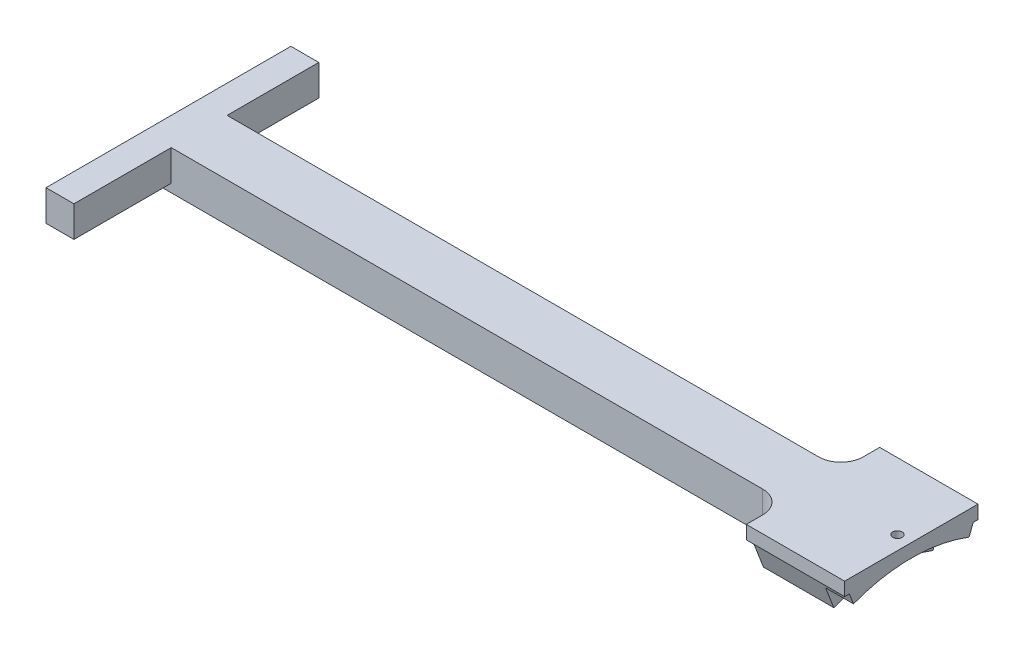
ISO-10303-21;
HEADER;
FILE_DESCRIPTION(('STEP AP214'),'2;1');
FILE_NAME('part.step','',(''),(''),'','','');
FILE_SCHEMA(('AUTOMOTIVE_DESIGN { 1 0 10303 214 1 1 1 1 }'));
ENDSEC;
DATA;
#1=APPLICATION_CONTEXT('core data for automotive mechanical design processes');
#2=APPLICATION_PROTOCOL_DEFINITION('international standard','automotive_design',2000,#1);
#3=PRODUCT_CONTEXT('',#1,'mechanical');
#4=PRODUCT('Part','Part','',(#3));
#5=PRODUCT_RELATED_PRODUCT_CATEGORY('part','',(#4));
#6=PRODUCT_DEFINITION_FORMATION('','',#4);
#7=PRODUCT_DEFINITION_CONTEXT('part definition',#1,'design');
#8=PRODUCT_DEFINITION('design','',#6,#7);
#9=PRODUCT_DEFINITION_SHAPE('','',#8);
#10=(LENGTH_UNIT() NAMED_UNIT(*) SI_UNIT(.MILLI.,.METRE.));
#11=(NAMED_UNIT(*) PLANE_ANGLE_UNIT() SI_UNIT($,.RADIAN.));
#12=(NAMED_UNIT(*) SI_UNIT($,.STERADIAN.) SOLID_ANGLE_UNIT());
#13=UNCERTAINTY_MEASURE_WITH_UNIT(LENGTH_MEASURE(1.E-05),#10,'distance_accuracy_value','');
#14=(GEOMETRIC_REPRESENTATION_CONTEXT(3) GLOBAL_UNCERTAINTY_ASSIGNED_CONTEXT((#13)) GLOBAL_UNIT_ASSIGNED_CONTEXT((#10,
#11,#12)) REPRESENTATION_CONTEXT('',''));
#15=CARTESIAN_POINT('',(0.,0.,0.));
#16=DIRECTION('',(0.,0.,1.));
#17=DIRECTION('',(1.,0.,0.));
#18=AXIS2_PLACEMENT_3D('',#15,#16,#17);
#19=CARTESIAN_POINT('',(0.,0.,0.));
#20=DIRECTION('',(-1.,0.,0.));
#21=DIRECTION('',(0.,0.,1.));
#22=AXIS2_PLACEMENT_3D('',#19,#20,#21);
#23=CYLINDRICAL_SURFACE('',#22,57.604900141811);
#24=DIRECTION('',(-1.,0.,0.));
#25=VECTOR('',#24,1.);
#26=CARTESIAN_POINT('',(0.,53.7568283113329,20.700916169433));
#27=LINE('',#26,#25);
#28=CARTESIAN_POINT('',(0.,53.7568283113329,20.700916169433));
#29=VERTEX_POINT('',#28);
#30=CARTESIAN_POINT('',(-10.,53.7568283113329,20.700916169433));
#31=VERTEX_POINT('',#30);
#32=EDGE_CURVE('E459',#29,#31,#27,.T.);
#33=ORIENTED_EDGE('',*,*,#32,.T.);
#34=CARTESIAN_POINT('',(-10.,0.,0.));
#35=DIRECTION('',(1.,0.,0.));
#36=DIRECTION('',(0.,0.,-1.));
#37=AXIS2_PLACEMENT_3D('',#34,#35,#36);
#38=CIRCLE('',#37,57.604900141811);
#39=CARTESIAN_POINT('',(-10.,53.7568283113329,-20.700916169433));
#40=VERTEX_POINT('',#39);
#41=EDGE_CURVE('E448',#40,#31,#38,.T.);
#42=ORIENTED_EDGE('',*,*,#41,.F.);
#43=DIRECTION('',(-1.,0.,0.));
#44=VECTOR('',#43,1.);
#45=CARTESIAN_POINT('',(0.,53.7568283113329,-20.700916169433));
#46=LINE('',#45,#44);
#47=CARTESIAN_POINT('',(0.,53.7568283113329,-20.700916169433));
#48=VERTEX_POINT('',#47);
#49=EDGE_CURVE('E456',#48,#40,#46,.T.);
#50=ORIENTED_EDGE('',*,*,#49,.F.);
#51=CARTESIAN_POINT('',(0.,0.,0.));
#52=DIRECTION('',(1.,0.,0.));
#53=DIRECTION('',(0.,0.,-1.));
#54=AXIS2_PLACEMENT_3D('',#51,#52,#53);
#55=CIRCLE('',#54,57.604900141811);
#56=EDGE_CURVE('E452',#48,#29,#55,.T.);
#57=ORIENTED_EDGE('',*,*,#56,.T.);
#58=EDGE_LOOP('',(#33,#42,#50,#57));
#59=FACE_BOUND('',#58,.T.);
#60=CARTESIAN_POINT('',(-4.96006567941271,57.579810006182,-1.7));
#61=CARTESIAN_POINT('',(-5.05553311554205,57.5798103447455,-1.69999577323189));
#62=CARTESIAN_POINT('',(-5.15106924539671,57.5800499843773,-1.69193121472459));
#63=CARTESIAN_POINT('',(-5.3395088598662,57.5809828822527,-1.65987285859885));
#64=CARTESIAN_POINT('',(-5.43240906053109,57.5816766824675,-1.6358600286541));
#65=CARTESIAN_POINT('',(-5.61281962816178,57.5834392398156,-1.57259068851522));
#66=CARTESIAN_POINT('',(-5.70033260567587,57.5845078136323,-1.53334162996542));
#67=CARTESIAN_POINT('',(-5.86750316137931,57.5868992769102,-1.44072464079895));
#68=CARTESIAN_POINT('',(-5.94716265179923,57.5882221042313,-1.38736015883272));
#69=CARTESIAN_POINT('',(-6.09642505390916,57.5909737092521,-1.26799916596643));
#70=CARTESIAN_POINT('',(-6.16602416577372,57.5924025266777,-1.20199790389435));
#71=CARTESIAN_POINT('',(-6.29315820063436,57.5952047122057,-1.05924511288219));
#72=CARTESIAN_POINT('',(-6.35069264341629,57.5965780780992,-0.982493156231278));
#73=CARTESIAN_POINT('',(-6.45206986502236,57.5991147395295,-0.820403861209776));
#74=CARTESIAN_POINT('',(-6.49591039898614,57.6002780006104,-0.735065118224517));
#75=CARTESIAN_POINT('',(-6.56864070161737,57.6022630169661,-0.558234726172175));
#76=CARTESIAN_POINT('',(-6.59753052925283,57.603084773588,-0.466743101374657));
#77=CARTESIAN_POINT('',(-6.63953126836139,57.6042939351153,-0.280232443757345));
#78=CARTESIAN_POINT('',(-6.65264680483554,57.6046814673325,-0.185214453290141));
#79=CARTESIAN_POINT('',(-6.66274090596121,57.6049789222708,0.00567530881562272));
#80=CARTESIAN_POINT('',(-6.65971953384531,57.6048888468633,0.101547077107178));
#81=CARTESIAN_POINT('',(-6.63762949483097,57.604241349402,0.291391609341713));
#82=CARTESIAN_POINT('',(-6.61856582303579,57.6036840728213,0.385364955072391));
#83=CARTESIAN_POINT('',(-6.5649400585497,57.6021651479062,0.568776923371601));
#84=CARTESIAN_POINT('',(-6.53037793237627,57.6012034986982,0.658215536142934));
#85=CARTESIAN_POINT('',(-6.44673062496777,57.5989839620305,0.830035251852829));
#86=CARTESIAN_POINT('',(-6.39764315468282,57.5977260278857,0.912415239781583));
#87=CARTESIAN_POINT('',(-6.28634028127957,57.5950556891172,1.06776699822224));
#88=CARTESIAN_POINT('',(-6.22412484929973,57.593643284154,1.14073874804977));
#89=CARTESIAN_POINT('',(-6.08830384527665,57.5908225432418,1.27523175232139));
#90=CARTESIAN_POINT('',(-6.01469393830778,57.5894142090501,1.3367486291584));
#91=CARTESIAN_POINT('',(-5.85818879868786,57.5867609286331,1.44655193942098));
#92=CARTESIAN_POINT('',(-5.77529356452058,57.5855159824344,1.49483837068607));
#93=CARTESIAN_POINT('',(-5.602568419556,57.5833298916476,1.57680962740958));
#94=CARTESIAN_POINT('',(-5.51273844160758,57.5823887500017,1.61049431145418));
#95=CARTESIAN_POINT('',(-5.32869488427355,57.5809165113515,1.66230306777655));
#96=CARTESIAN_POINT('',(-5.23448131646043,57.5803854132646,1.68042718113116));
#97=CARTESIAN_POINT('',(-5.04438305725526,57.5797933412208,1.70059494617237));
#98=CARTESIAN_POINT('',(-4.94849900975065,57.5797321899721,1.70264466207484));
#99=CARTESIAN_POINT('',(-4.757748160823,57.580086444186,1.69062125058452));
#100=CARTESIAN_POINT('',(-4.66288135826088,57.5805018491147,1.67654814124742));
#101=CARTESIAN_POINT('',(-4.4768748573569,57.5817622253542,1.63268358773899));
#102=CARTESIAN_POINT('',(-4.38573450867709,57.5826071213618,1.60289489896386));
#103=CARTESIAN_POINT('',(-4.20974810723365,57.584631170159,1.5284475779771));
#104=CARTESIAN_POINT('',(-4.1249020666998,57.5858103235982,1.4837889168742));
#105=CARTESIAN_POINT('',(-3.96388483020763,57.5883703937989,1.38085372447314));
#106=CARTESIAN_POINT('',(-3.88771624621608,57.5897513710265,1.32257310890925));
#107=CARTESIAN_POINT('',(-3.7462423118271,57.5925591956337,1.19405438139672));
#108=CARTESIAN_POINT('',(-3.68093698840395,57.5939860431272,1.12381623975752));
#109=CARTESIAN_POINT('',(-3.56302313170761,57.5967252746004,0.973350301535911));
#110=CARTESIAN_POINT('',(-3.51041850936349,57.5980376232433,0.893119439392559));
#111=CARTESIAN_POINT('',(-3.4194260583521,57.6003994168846,0.724961184962815));
#112=CARTESIAN_POINT('',(-3.38103819820837,57.6014488624652,0.63703380971734));
#113=CARTESIAN_POINT('',(-3.31957581752706,57.603166380661,0.455993215474249));
#114=CARTESIAN_POINT('',(-3.29649876232647,57.6038345163985,0.362880857604553));
#115=CARTESIAN_POINT('',(-3.26630475044599,57.6047143489454,0.174101203657788));
#116=CARTESIAN_POINT('',(-3.25918778117303,57.604926046115,0.0784339095967123));
#117=CARTESIAN_POINT('',(-3.26111626161472,57.6048691414938,-0.112700838653114));
#118=CARTESIAN_POINT('',(-3.27015554777957,57.6046007228654,-0.208168355146331));
#119=CARTESIAN_POINT('',(-3.30412727447791,57.6036141917931,-0.396230164330897));
#120=CARTESIAN_POINT('',(-3.32905974649077,57.6028960784586,-0.488824451330907));
#121=CARTESIAN_POINT('',(-3.39410927819022,57.6010910468065,-0.668513802623803));
#122=CARTESIAN_POINT('',(-3.43422659296129,57.6000041222934,-0.755608774507073));
#123=CARTESIAN_POINT('',(-3.52850483818178,57.5975839415571,-0.921825476891356));
#124=CARTESIAN_POINT('',(-3.58266525934117,57.5962506942676,-1.00094749639654));
#125=CARTESIAN_POINT('',(-3.70351019870148,57.5934875860355,-1.14900048290087));
#126=CARTESIAN_POINT('',(-3.77019815614383,57.5920576986309,-1.21792864202357));
#127=CARTESIAN_POINT('',(-3.91421884572388,57.5892624018306,-1.34362973402797));
#128=CARTESIAN_POINT('',(-3.99155420991675,57.5878970084904,-1.40039965247869));
#129=CARTESIAN_POINT('',(-4.15470417374536,57.5853842104057,-1.50018213002876));
#130=CARTESIAN_POINT('',(-4.24052419278354,57.5842369463722,-1.54318582094825));
#131=CARTESIAN_POINT('',(-4.41810314250526,57.5822923657631,-1.61412436895367));
#132=CARTESIAN_POINT('',(-4.5098548427762,57.5814946320248,-1.64207719833863));
#133=CARTESIAN_POINT('',(-4.66183285275432,57.5805523472232,-1.67471142967309));
#134=CARTESIAN_POINT('',(-4.72107266845227,57.5802751784265,-1.68418271418848));
#135=CARTESIAN_POINT('',(-4.84022119081465,57.5799039016546,-1.69682832526564));
#136=CARTESIAN_POINT('',(-4.90012989728828,57.5798097936272,-1.70000265362371));
#137=CARTESIAN_POINT('',(-4.96006567941271,57.579810006182,-1.7));
#138=B_SPLINE_CURVE_WITH_KNOTS('',3,(#60,#61,#62,#63,#64,#65,#66,#67,#68,#69,#70,#71,#72,#73,
#74,#75,#76,#77,#78,#79,#80,#81,#82,#83,#84,#85,#86,#87,#88,#89,#90,#91,#92,#93,#94,#95,#96,#97,
#98,#99,#100,#101,#102,#103,#104,#105,#106,#107,#108,#109,#110,#111,#112,#113,#114,#115,#116,
#117,#118,#119,#120,#121,#122,#123,#124,#125,#126,#127,#128,#129,#130,#131,#132,#133,#134,#135,
#136,#137),.UNSPECIFIED.,.T.,.F.,(4,2,2,2,2,2,2,2,2,2,2,2,2,2,2,2,2,2,2,2,2,2,2,2,2,2,2,2,2,2,2,
2,2,2,2,2,2,2,4),(0.,0.286183535152402,0.572709210761384,0.859094930283015,1.14541074517478,
1.4318344211299,1.71826949554128,2.00475150101521,2.29123237654938,2.57762923578185,
2.86402497276703,3.15033156747175,3.43663878070979,3.72299113717,4.00934412317635,
4.29580631856805,4.58226856073745,4.8687335771511,5.1551978373515,5.44155402104556,
5.72790988405443,6.01421555726476,6.3005217867495,6.58691396969858,6.87330686377024,
7.15978783469895,7.44626817134371,7.73270107008961,8.01913374282989,8.30545716592108,
8.5917811561303,8.87810995640262,9.16442837407108,9.45082551121538,9.73729357371293,
10.023945808793,10.3102549877833,10.489925036535,10.6695950340329),.UNSPECIFIED.);
#139=CARTESIAN_POINT('',(-4.96006567941271,57.579810006182,-1.7));
#140=VERTEX_POINT('',#139);
#141=EDGE_CURVE('E324',#140,#140,#138,.T.);
#142=ORIENTED_EDGE('',*,*,#141,.T.);
#143=EDGE_LOOP('',(#142));
#144=FACE_BOUND('',#143,.T.);
#145=ADVANCED_FACE('F41',(#59,#144),#23,.F.);
#146=CARTESIAN_POINT('',(-10.,0.,0.));
#147=DIRECTION('',(-1.,0.,0.));
#148=DIRECTION('',(0.,0.,1.));
#149=AXIS2_PLACEMENT_3D('',#146,#147,#148);
#150=PLANE('',#149);
#151=DIRECTION('',(0.,0.93319888028614,-0.359360334250589));
#152=VECTOR('',#151,1.);
#153=CARTESIAN_POINT('',(-10.,46.1045974929866,-17.7541614285782));
#154=LINE('',#153,#152);
#155=CARTESIAN_POINT('',(-10.,46.1045974929866,-17.7541614285782));
#156=VERTEX_POINT('',#155);
#157=EDGE_CURVE('E462',#156,#40,#154,.T.);
#158=ORIENTED_EDGE('',*,*,#157,.T.);
#159=ORIENTED_EDGE('',*,*,#41,.T.);
#160=DIRECTION('',(0.,-0.93319888028614,-0.359360334250589));
#161=VECTOR('',#160,1.);
#162=CARTESIAN_POINT('',(-10.,58.2361829367064,22.4258457738358));
#163=LINE('',#162,#161);
#164=CARTESIAN_POINT('',(-10.,46.1045974929866,17.7541614285782));
#165=VERTEX_POINT('',#164);
#166=EDGE_CURVE('E373',#31,#165,#163,.T.);
#167=ORIENTED_EDGE('',*,*,#166,.T.);
#168=CARTESIAN_POINT('',(-10.,0.,0.));
#169=DIRECTION('',(-1.,0.,0.));
#170=DIRECTION('',(0.,0.,1.));
#171=AXIS2_PLACEMENT_3D('',#168,#169,#170);
#172=CIRCLE('',#171,49.404900141811);
#173=EDGE_CURVE('E371',#165,#156,#172,.T.);
#174=ORIENTED_EDGE('',*,*,#173,.T.);
#175=EDGE_LOOP('',(#158,#159,#167,#174));
#176=FACE_BOUND('',#175,.T.);
#177=ADVANCED_FACE('F341',(#176),#150,.F.);
#178=CARTESIAN_POINT('',(-20.,46.1045974929866,-17.7541614285782));
#179=DIRECTION('',(0.,-0.359360334250589,-0.93319888028614));
#180=DIRECTION('',(0.,0.93319888028614,-0.359360334250589));
#181=AXIS2_PLACEMENT_3D('',#178,#179,#180);
#182=PLANE('',#181);
#183=DIRECTION('',(0.,-0.93319888028614,0.359360334250589));
#184=VECTOR('',#183,1.);
#185=CARTESIAN_POINT('',(-35.208375229169,46.1045974929866,-17.7541614285782));
#186=LINE('',#185,#184);
#187=CARTESIAN_POINT('',(-35.208375229169,57.604900141811,-22.1827486152637));
#188=VERTEX_POINT('',#187);
#189=CARTESIAN_POINT('',(-35.208375229169,46.7429992800409,-18.));
#190=VERTEX_POINT('',#189);
#191=EDGE_CURVE('E272',#188,#190,#186,.T.);
#192=ORIENTED_EDGE('',*,*,#191,.F.);
#193=DIRECTION('',(-1.,0.,0.));
#194=VECTOR('',#193,1.);
#195=CARTESIAN_POINT('',(-20.,57.604900141811,-22.1827486152637));
#196=LINE('',#195,#194);
#197=CARTESIAN_POINT('',(0.,57.604900141811,-22.1827486152637));
#198=VERTEX_POINT('',#197);
#199=EDGE_CURVE('E444',#198,#188,#196,.T.);
#200=ORIENTED_EDGE('',*,*,#199,.F.);
#201=DIRECTION('',(0.,-0.93319888028614,0.359360334250589));
#202=VECTOR('',#201,1.);
#203=CARTESIAN_POINT('',(0.,58.2361829367064,-22.4258457738358));
#204=LINE('',#203,#202);
#205=EDGE_CURVE('E454',#198,#48,#204,.T.);
#206=ORIENTED_EDGE('',*,*,#205,.T.);
#207=ORIENTED_EDGE('',*,*,#49,.T.);
#208=ORIENTED_EDGE('',*,*,#157,.F.);
#209=DIRECTION('',(1.,0.,0.));
#210=VECTOR('',#209,1.);
#211=CARTESIAN_POINT('',(-20.,46.1045974929866,-17.7541614285782));
#212=LINE('',#211,#210);
#213=CARTESIAN_POINT('',(-35.2121534090341,46.1045974929866,-17.7541614285782));
#214=VERTEX_POINT('',#213);
#215=EDGE_CURVE('E372',#214,#156,#212,.T.);
#216=ORIENTED_EDGE('',*,*,#215,.F.);
#217=CARTESIAN_POINT('',(-43.208375229169,46.7429992800409,-18.));
#218=DIRECTION('',(0.,-0.359360334250589,-0.93319888028614));
#219=DIRECTION('',(0.,0.93319888028614,-0.359360334250589));
#220=AXIS2_PLACEMENT_3D('',#217,#218,#219);
#221=ELLIPSE('',#220,22.2617780470491,8.);
#222=EDGE_CURVE('E392',#190,#214,#221,.T.);
#223=ORIENTED_EDGE('',*,*,#222,.F.);
#224=EDGE_LOOP('',(#192,#200,#206,#207,#208,#216,#223));
#225=FACE_BOUND('',#224,.T.);
#226=ADVANCED_FACE('F43',(#225),#182,.T.);
#227=CARTESIAN_POINT('',(-20.,0.,0.));
#228=DIRECTION('',(1.,0.,0.));
#229=DIRECTION('',(0.,0.,-1.));
#230=AXIS2_PLACEMENT_3D('',#227,#228,#229);
#231=CYLINDRICAL_SURFACE('',#230,49.404900141811);
#232=CARTESIAN_POINT('',(-35.2121534090341,46.1045974929866,-17.7541614285782));
#233=CARTESIAN_POINT('',(-35.2190456400472,46.1911944321842,-17.5293301644999));
#234=CARTESIAN_POINT('',(-35.2354820685898,46.2760274826877,-17.30408348048));
#235=CARTESIAN_POINT('',(-35.2876088433585,46.4417276400094,-16.8542905564883));
#236=CARTESIAN_POINT('',(-35.3233047292953,46.5225935984452,-16.6297445367524));
#237=CARTESIAN_POINT('',(-35.4141820266964,46.6799920414862,-16.1826717505035));
#238=CARTESIAN_POINT('',(-35.4693933385869,46.7565176661113,-15.9601486230085));
#239=CARTESIAN_POINT('',(-35.5992668937207,46.9047128997615,-15.5192179681985));
#240=CARTESIAN_POINT('',(-35.6739271086205,46.9763830141906,-15.3008100142541));
#241=CARTESIAN_POINT('',(-35.8427147092334,47.1147253445218,-14.8693732838319));
#242=CARTESIAN_POINT('',(-35.9368865031196,47.1813856781457,-14.6563580443991));
#243=CARTESIAN_POINT('',(-36.1442113324693,47.3092926897584,-14.2380762581859));
#244=CARTESIAN_POINT('',(-36.2573639658246,47.370539482391,-14.0328095473662));
#245=CARTESIAN_POINT('',(-36.5019331608854,47.4874079663005,-13.6320858607202));
#246=CARTESIAN_POINT('',(-36.6333301393194,47.5430355799852,-13.4366186683962));
#247=CARTESIAN_POINT('',(-36.9136743968671,47.6486668645516,-13.0570865802308));
#248=CARTESIAN_POINT('',(-37.0626207302576,47.698670838204,-12.8730210707751));
#249=CARTESIAN_POINT('',(-37.3699370171658,47.7909244006141,-12.5260714473044));
#250=CARTESIAN_POINT('',(-37.5275766055438,47.8334223435837,-12.3626059647592));
#251=CARTESIAN_POINT('',(-37.8568728529767,47.9133518690152,-12.0491096648173));
#252=CARTESIAN_POINT('',(-38.0285289877922,47.9507836408201,-11.8990783454028));
#253=CARTESIAN_POINT('',(-38.3847194245594,48.0206936825643,-11.6137303440724));
#254=CARTESIAN_POINT('',(-38.5692586954314,48.0531700256785,-11.4784193917335));
#255=CARTESIAN_POINT('',(-38.9498006651667,48.113279833495,-11.2237953366706));
#256=CARTESIAN_POINT('',(-39.1458029052671,48.140913491831,-11.1044815943457));
#257=CARTESIAN_POINT('',(-39.5412809628533,48.1906645233408,-10.8865102509489));
#258=CARTESIAN_POINT('',(-39.7404382676964,48.2129316645917,-10.7873084712016));
#259=CARTESIAN_POINT('',(-40.1466810520978,48.2532043844545,-10.6057097325914));
#260=CARTESIAN_POINT('',(-40.3537662197249,48.2712101305362,-10.5233121133546));
#261=CARTESIAN_POINT('',(-40.7741828467399,48.3030739604964,-10.3760726713079));
#262=CARTESIAN_POINT('',(-40.9875084354252,48.3169358132112,-10.3112149013039));
#263=CARTESIAN_POINT('',(-41.4189625311927,48.3406392464427,-10.1995095056361));
#264=CARTESIAN_POINT('',(-41.6370893339313,48.3504822300807,-10.1526555945621));
#265=CARTESIAN_POINT('',(-42.0800429724229,48.3663639214164,-10.0767365314598));
#266=CARTESIAN_POINT('',(-42.3049212535819,48.372341288752,-10.0479584054324));
#267=CARTESIAN_POINT('',(-42.7559925470466,48.3802882078068,-10.0095917616904));
#268=CARTESIAN_POINT('',(-42.9821826697855,48.3822645644061,-9.99997066234993));
#269=CARTESIAN_POINT('',(-43.208375229169,48.382271112695,-10.));
#270=B_SPLINE_CURVE_WITH_KNOTS('',3,(#232,#233,#234,#235,#236,#237,#238,#239,#240,#241,#242,
#243,#244,#245,#246,#247,#248,#249,#250,#251,#252,#253,#254,#255,#256,#257,#258,#259,#260,#261,
#262,#263,#264,#265,#266,#267,#268,#269),.UNSPECIFIED.,.F.,.F.,(4,2,2,2,2,2,2,2,2,2,2,2,2,2,2,2,
2,2,4),(0.,0.722937252157156,1.44608255794019,2.17034066301235,2.89452326478255,
3.62037257081997,4.34620650171495,5.07126726856687,5.79628898022691,6.48853609340927,
7.18075732737443,7.87324703635439,8.5657090499344,9.2357261586599,9.90571693181597,
10.5750964870222,11.2442421392624,11.923761064797,12.6021232968892),.UNSPECIFIED.);
#271=CARTESIAN_POINT('',(-43.208375229169,48.382271112695,-10.));
#272=VERTEX_POINT('',#271);
#273=EDGE_CURVE('E287',#214,#272,#270,.T.);
#274=ORIENTED_EDGE('',*,*,#273,.F.);
#275=ORIENTED_EDGE('',*,*,#215,.T.);
#276=ORIENTED_EDGE('',*,*,#173,.F.);
#277=DIRECTION('',(1.,0.,0.));
#278=VECTOR('',#277,1.);
#279=CARTESIAN_POINT('',(-20.,46.1045974929866,17.7541614285782));
#280=LINE('',#279,#278);
#281=CARTESIAN_POINT('',(-35.2121534090341,46.1045974929866,17.7541614285782));
#282=VERTEX_POINT('',#281);
#283=EDGE_CURVE('E362',#282,#165,#280,.T.);
#284=ORIENTED_EDGE('',*,*,#283,.F.);
#285=CARTESIAN_POINT('',(-43.208375229169,48.382271112695,10.));
#286=CARTESIAN_POINT('',(-42.9876157917755,48.3822651312004,9.99997369045891));
#287=CARTESIAN_POINT('',(-42.7668601306146,48.3803823271087,10.0091366459315));
#288=CARTESIAN_POINT('',(-42.3269361234929,48.3728197830737,10.0456511514377));
#289=CARTESIAN_POINT('',(-42.1077676854507,48.3671402652063,10.073001637653));
#290=CARTESIAN_POINT('',(-41.6727898425288,48.351948631148,10.145664869188));
#291=CARTESIAN_POINT('',(-41.456977290448,48.3424403628922,10.190959579634));
#292=CARTESIAN_POINT('',(-41.0300222124321,48.3195092998038,10.2991385048713));
#293=CARTESIAN_POINT('',(-40.8188796350111,48.3060865481511,10.3620225256382));
#294=CARTESIAN_POINT('',(-40.4026684182386,48.2752157478746,10.50490534803));
#295=CARTESIAN_POINT('',(-40.1976024272773,48.2577659724228,10.5849114907194));
#296=CARTESIAN_POINT('',(-39.7950791747945,48.2187219087164,10.7613743272055));
#297=CARTESIAN_POINT('',(-39.597622102689,48.1971275173659,10.8578314302076));
#298=CARTESIAN_POINT('',(-39.2117306397402,48.1496683857839,11.0663915044507));
#299=CARTESIAN_POINT('',(-39.0232948163269,48.1238043264946,11.1784919803887));
#300=CARTESIAN_POINT('',(-38.6567073172833,48.0676755926395,11.4174329411001));
#301=CARTESIAN_POINT('',(-38.4785556151094,48.0374109294325,11.5442733878265));
#302=CARTESIAN_POINT('',(-38.1331341734737,47.9722527293363,11.8121200922005));
#303=CARTESIAN_POINT('',(-37.9659042583214,47.9373435242854,11.9531738888945));
#304=CARTESIAN_POINT('',(-37.6440954861538,47.8628839884054,12.2479219667165));
#305=CARTESIAN_POINT('',(-37.4895168202497,47.823333587488,12.4016164387255));
#306=CARTESIAN_POINT('',(-37.1939686346,47.7395297204901,12.7204015628274));
#307=CARTESIAN_POINT('',(-37.0529999915985,47.6952759518086,12.8854929479247));
#308=CARTESIAN_POINT('',(-36.7855090406763,47.602050800681,13.2257334866792));
#309=CARTESIAN_POINT('',(-36.6589867282485,47.5530794197068,13.4008826371983));
#310=CARTESIAN_POINT('',(-36.4190389028664,47.4495764398284,13.7629171979025));
#311=CARTESIAN_POINT('',(-36.3058729596426,47.3949643895656,13.9499516256568));
#312=CARTESIAN_POINT('',(-36.0957345147822,47.2809845790062,14.3315143722811));
#313=CARTESIAN_POINT('',(-35.99876246375,47.2216166864436,14.5260428994935));
#314=CARTESIAN_POINT('',(-35.8213900831763,47.0982628747334,14.9211462982422));
#315=CARTESIAN_POINT('',(-35.7409927153576,47.0342761329988,15.1217222430618));
#316=CARTESIAN_POINT('',(-35.5970482918395,46.9019338064516,15.5273412708856));
#317=CARTESIAN_POINT('',(-35.5334984316569,46.8335789511214,15.732383604245));
#318=CARTESIAN_POINT('',(-35.398675860486,46.6612016025657,16.2381028994277));
#319=CARTESIAN_POINT('',(-35.3366586608924,46.5548986665089,16.5405417455487));
#320=CARTESIAN_POINT('',(-35.2702175398521,46.3899246851386,16.995444091756));
#321=CARTESIAN_POINT('',(-35.2525056012164,46.3340700821703,17.1471383077849));
#322=CARTESIAN_POINT('',(-35.2258065348808,46.2206128688346,17.4506549156091));
#323=CARTESIAN_POINT('',(-35.2168200578681,46.1630101284328,17.6024773161186));
#324=CARTESIAN_POINT('',(-35.2121534090341,46.1045974929866,17.7541614285782));
#325=B_SPLINE_CURVE_WITH_KNOTS('',3,(#285,#286,#287,#288,#289,#290,#291,#292,#293,#294,#295,
#296,#297,#298,#299,#300,#301,#302,#303,#304,#305,#306,#307,#308,#309,#310,#311,#312,#313,#314,
#315,#316,#317,#318,#319,#320,#321,#322,#323,#324),.UNSPECIFIED.,.F.,.F.,(4,2,2,2,2,2,2,2,2,2,2,
2,2,2,2,2,2,2,2,4),(0.,0.662074823892631,1.32411092535104,1.98548332747296,2.64684843440646,
3.30849766999941,3.97016336602236,4.6317236389337,5.29328220425891,5.95713194409502,
6.62099171026819,7.28489421312831,7.94879650885035,8.62399884772452,9.29921997136657,
9.97456164559255,10.649790829863,11.6269821067215,12.1146357986835,12.6023258538401),.UNSPECIFIED.);
#326=CARTESIAN_POINT('',(-43.208375229169,48.382271112695,10.));
#327=VERTEX_POINT('',#326);
#328=EDGE_CURVE('E280',#327,#282,#325,.T.);
#329=ORIENTED_EDGE('',*,*,#328,.F.);
#330=DIRECTION('',(1.,0.,0.));
#331=VECTOR('',#330,1.);
#332=CARTESIAN_POINT('',(-20.,48.382271112695,10.));
#333=LINE('',#332,#331);
#334=CARTESIAN_POINT('',(-265.,48.382271112695,9.99999999999997));
#335=VERTEX_POINT('',#334);
#336=EDGE_CURVE('E251',#335,#327,#333,.T.);
#337=ORIENTED_EDGE('',*,*,#336,.F.);
#338=CARTESIAN_POINT('',(-265.,0.,0.));
#339=DIRECTION('',(1.,0.,0.));
#340=DIRECTION('',(0.,0.,1.));
#341=AXIS2_PLACEMENT_3D('',#338,#339,#340);
#342=CIRCLE('',#341,49.404900141811);
#343=CARTESIAN_POINT('',(-265.,48.382271112695,-9.99999999999997));
#344=VERTEX_POINT('',#343);
#345=EDGE_CURVE('E391',#344,#335,#342,.T.);
#346=ORIENTED_EDGE('',*,*,#345,.F.);
#347=DIRECTION('',(1.,0.,0.));
#348=VECTOR('',#347,1.);
#349=CARTESIAN_POINT('',(-20.,48.382271112695,-10.));
#350=LINE('',#349,#348);
#351=EDGE_CURVE('E268',#272,#344,#350,.F.);
#352=ORIENTED_EDGE('',*,*,#351,.F.);
#353=EDGE_LOOP('',(#274,#275,#276,#284,#329,#337,#346,#352));
#354=FACE_BOUND('',#353,.T.);
#355=ADVANCED_FACE('F294',(#354),#231,.F.);
#356=CARTESIAN_POINT('',(-20.,58.2361829367064,22.4258457738358));
#357=DIRECTION('',(0.,-0.359360334250589,0.93319888028614));
#358=DIRECTION('',(0.,-0.93319888028614,-0.359360334250589));
#359=AXIS2_PLACEMENT_3D('',#356,#357,#358);
#360=PLANE('',#359);
#361=CARTESIAN_POINT('',(-43.208375229169,46.7429992800409,18.));
#362=DIRECTION('',(0.,-0.359360334250589,0.93319888028614));
#363=DIRECTION('',(0.,0.93319888028614,0.359360334250589));
#364=AXIS2_PLACEMENT_3D('',#361,#362,#363);
#365=ELLIPSE('',#364,22.2617780470491,8.);
#366=CARTESIAN_POINT('',(-35.208375229169,46.7429992800409,18.));
#367=VERTEX_POINT('',#366);
#368=EDGE_CURVE('E278',#282,#367,#365,.T.);
#369=ORIENTED_EDGE('',*,*,#368,.F.);
#370=ORIENTED_EDGE('',*,*,#283,.T.);
#371=ORIENTED_EDGE('',*,*,#166,.F.);
#372=ORIENTED_EDGE('',*,*,#32,.F.);
#373=DIRECTION('',(0.,0.93319888028614,0.359360334250589));
#374=VECTOR('',#373,1.);
#375=CARTESIAN_POINT('',(0.,53.7568283113329,20.700916169433));
#376=LINE('',#375,#374);
#377=CARTESIAN_POINT('',(0.,57.604900141811,22.1827486152637));
#378=VERTEX_POINT('',#377);
#379=EDGE_CURVE('E449',#29,#378,#376,.T.);
#380=ORIENTED_EDGE('',*,*,#379,.T.);
#381=DIRECTION('',(1.,0.,0.));
#382=VECTOR('',#381,1.);
#383=CARTESIAN_POINT('',(-20.,57.604900141811,22.1827486152637));
#384=LINE('',#383,#382);
#385=CARTESIAN_POINT('',(-35.208375229169,57.604900141811,22.1827486152637));
#386=VERTEX_POINT('',#385);
#387=EDGE_CURVE('E442',#386,#378,#384,.T.);
#388=ORIENTED_EDGE('',*,*,#387,.F.);
#389=DIRECTION('',(0.,0.93319888028614,0.359360334250589));
#390=VECTOR('',#389,1.);
#391=CARTESIAN_POINT('',(-35.208375229169,58.2361829367064,22.4258457738358));
#392=LINE('',#391,#390);
#393=EDGE_CURVE('E276',#367,#386,#392,.T.);
#394=ORIENTED_EDGE('',*,*,#393,.F.);
#395=EDGE_LOOP('',(#369,#370,#371,#372,#380,#388,#394));
#396=FACE_BOUND('',#395,.T.);
#397=ADVANCED_FACE('F347',(#396),#360,.T.);
#398=CARTESIAN_POINT('',(0.,0.,0.));
#399=DIRECTION('',(1.,0.,0.));
#400=DIRECTION('',(0.,0.,-1.));
#401=AXIS2_PLACEMENT_3D('',#398,#399,#400);
#402=PLANE('',#401);
#403=DIRECTION('',(0.,0.,-1.));
#404=VECTOR('',#403,1.);
#405=CARTESIAN_POINT('',(0.,62.404900141811,23.8802785702158));
#406=LINE('',#405,#404);
#407=CARTESIAN_POINT('',(0.,62.404900141811,23.8802785702158));
#408=VERTEX_POINT('',#407);
#409=CARTESIAN_POINT('',(0.,62.404900141811,-23.8802785702158));
#410=VERTEX_POINT('',#409);
#411=EDGE_CURVE('E432',#408,#410,#406,.T.);
#412=ORIENTED_EDGE('',*,*,#411,.F.);
#413=DIRECTION('',(0.,1.,0.));
#414=VECTOR('',#413,1.);
#415=CARTESIAN_POINT('',(0.,57.604900141811,23.8802785702158));
#416=LINE('',#415,#414);
#417=CARTESIAN_POINT('',(0.,57.604900141811,23.8802785702158));
#418=VERTEX_POINT('',#417);
#419=EDGE_CURVE('E335',#418,#408,#416,.T.);
#420=ORIENTED_EDGE('',*,*,#419,.F.);
#421=DIRECTION('',(0.,0.,-1.));
#422=VECTOR('',#421,1.);
#423=CARTESIAN_POINT('',(0.,57.604900141811,23.8802785702158));
#424=LINE('',#423,#422);
#425=EDGE_CURVE('E445',#418,#378,#424,.T.);
#426=ORIENTED_EDGE('',*,*,#425,.T.);
#427=ORIENTED_EDGE('',*,*,#379,.F.);
#428=ORIENTED_EDGE('',*,*,#56,.F.);
#429=ORIENTED_EDGE('',*,*,#205,.F.);
#430=CARTESIAN_POINT('',(0.,57.604900141811,-23.8802785702158));
#431=VERTEX_POINT('',#430);
#432=EDGE_CURVE('E472',#198,#431,#424,.T.);
#433=ORIENTED_EDGE('',*,*,#432,.T.);
#434=DIRECTION('',(0.,-1.,0.));
#435=VECTOR('',#434,1.);
#436=CARTESIAN_POINT('',(0.,62.404900141811,-23.8802785702158));
#437=LINE('',#436,#435);
#438=EDGE_CURVE('E440',#410,#431,#437,.T.);
#439=ORIENTED_EDGE('',*,*,#438,.F.);
#440=EDGE_LOOP('',(#412,#420,#426,#427,#428,#429,#433,#439));
#441=FACE_BOUND('',#440,.T.);
#442=ADVANCED_FACE('F343',(#441),#402,.T.);
#443=CARTESIAN_POINT('',(-68.0011543440825,57.604900141811,23.8802785702158));
#444=DIRECTION('',(0.,-1.,0.));
#445=DIRECTION('',(0.,0.,-1.));
#446=AXIS2_PLACEMENT_3D('',#443,#444,#445);
#447=PLANE('',#446);
#448=DIRECTION('',(0.,0.,1.));
#449=VECTOR('',#448,1.);
#450=CARTESIAN_POINT('',(-35.2083752291691,57.604900141811,23.8802785702159));
#451=LINE('',#450,#449);
#452=CARTESIAN_POINT('',(-35.208375229169,57.604900141811,-23.8802785702158));
#453=VERTEX_POINT('',#452);
#454=EDGE_CURVE('E270',#453,#188,#451,.T.);
#455=ORIENTED_EDGE('',*,*,#454,.F.);
#456=DIRECTION('',(1.,0.,0.));
#457=VECTOR('',#456,1.);
#458=CARTESIAN_POINT('',(-68.0011543440825,57.604900141811,-23.8802785702158));
#459=LINE('',#458,#457);
#460=EDGE_CURVE('E332',#453,#431,#459,.T.);
#461=ORIENTED_EDGE('',*,*,#460,.T.);
#462=ORIENTED_EDGE('',*,*,#432,.F.);
#463=ORIENTED_EDGE('',*,*,#199,.T.);
#464=EDGE_LOOP('',(#455,#461,#462,#463));
#465=FACE_BOUND('',#464,.T.);
#466=ADVANCED_FACE('F355',(#465),#447,.T.);
#467=CARTESIAN_POINT('',(-68.0011543440825,62.404900141811,23.8802785702158));
#468=DIRECTION('',(0.,-1.,0.));
#469=DIRECTION('',(0.,0.,-1.));
#470=AXIS2_PLACEMENT_3D('',#467,#468,#469);
#471=PLANE('',#470);
#472=DIRECTION('',(0.,0.,-1.));
#473=VECTOR('',#472,1.);
#474=CARTESIAN_POINT('',(-265.,62.404900141811,23.8802785702158));
#475=LINE('',#474,#473);
#476=CARTESIAN_POINT('',(-265.,62.404900141811,44.8485469815196));
#477=VERTEX_POINT('',#476);
#478=CARTESIAN_POINT('',(-265.,62.404900141811,-42.8355056978477));
#479=VERTEX_POINT('',#478);
#480=EDGE_CURVE('E388',#477,#479,#475,.T.);
#481=ORIENTED_EDGE('',*,*,#480,.F.);
#482=DIRECTION('',(-1.,0.,0.));
#483=VECTOR('',#482,1.);
#484=CARTESIAN_POINT('',(-255.,62.404900141811,44.8485469815196));
#485=LINE('',#484,#483);
#486=CARTESIAN_POINT('',(-255.,62.404900141811,44.8485469815196));
#487=VERTEX_POINT('',#486);
#488=EDGE_CURVE('E230',#487,#477,#485,.T.);
#489=ORIENTED_EDGE('',*,*,#488,.F.);
#490=DIRECTION('',(0.,0.,-1.));
#491=VECTOR('',#490,1.);
#492=CARTESIAN_POINT('',(-255.,62.404900141811,-42.8355056978477));
#493=LINE('',#492,#491);
#494=CARTESIAN_POINT('',(-255.,62.404900141811,9.99999999999998));
#495=VERTEX_POINT('',#494);
#496=EDGE_CURVE('E200',#487,#495,#493,.T.);
#497=ORIENTED_EDGE('',*,*,#496,.T.);
#498=DIRECTION('',(-1.,0.,0.));
#499=VECTOR('',#498,1.);
#500=CARTESIAN_POINT('',(-43.208375229169,62.404900141811,10.));
#501=LINE('',#500,#499);
#502=CARTESIAN_POINT('',(-43.208375229169,62.404900141811,10.));
#503=VERTEX_POINT('',#502);
#504=EDGE_CURVE('E61',#503,#495,#501,.T.);
#505=ORIENTED_EDGE('',*,*,#504,.F.);
#506=CARTESIAN_POINT('',(-43.208375229169,62.404900141811,18.));
#507=DIRECTION('',(0.,1.,0.));
#508=DIRECTION('',(0.,0.,-1.));
#509=AXIS2_PLACEMENT_3D('',#506,#507,#508);
#510=CIRCLE('',#509,8.);
#511=CARTESIAN_POINT('',(-35.208375229169,62.404900141811,18.));
#512=VERTEX_POINT('',#511);
#513=EDGE_CURVE('E242',#512,#503,#510,.T.);
#514=ORIENTED_EDGE('',*,*,#513,.F.);
#515=DIRECTION('',(0.,0.,-1.));
#516=VECTOR('',#515,1.);
#517=CARTESIAN_POINT('',(-35.208375229169,62.404900141811,23.8802785702158));
#518=LINE('',#517,#516);
#519=CARTESIAN_POINT('',(-35.208375229169,62.404900141811,23.8802785702158));
#520=VERTEX_POINT('',#519);
#521=EDGE_CURVE('E258',#520,#512,#518,.T.);
#522=ORIENTED_EDGE('',*,*,#521,.F.);
#523=DIRECTION('',(1.,0.,0.));
#524=VECTOR('',#523,1.);
#525=CARTESIAN_POINT('',(-68.0011543440825,62.404900141811,23.8802785702158));
#526=LINE('',#525,#524);
#527=EDGE_CURVE('E426',#520,#408,#526,.T.);
#528=ORIENTED_EDGE('',*,*,#527,.T.);
#529=ORIENTED_EDGE('',*,*,#411,.T.);
#530=DIRECTION('',(1.,0.,0.));
#531=VECTOR('',#530,1.);
#532=CARTESIAN_POINT('',(-68.0011543440825,62.404900141811,-23.8802785702158));
#533=LINE('',#532,#531);
#534=CARTESIAN_POINT('',(-35.208375229169,62.404900141811,-23.8802785702158));
#535=VERTEX_POINT('',#534);
#536=EDGE_CURVE('E434',#535,#410,#533,.T.);
#537=ORIENTED_EDGE('',*,*,#536,.F.);
#538=DIRECTION('',(0.,0.,-1.));
#539=VECTOR('',#538,1.);
#540=CARTESIAN_POINT('',(-35.208375229169,62.404900141811,-23.8802785702158));
#541=LINE('',#540,#539);
#542=CARTESIAN_POINT('',(-35.208375229169,62.404900141811,-18.));
#543=VERTEX_POINT('',#542);
#544=EDGE_CURVE('E245',#543,#535,#541,.T.);
#545=ORIENTED_EDGE('',*,*,#544,.F.);
#546=CARTESIAN_POINT('',(-43.208375229169,62.404900141811,-18.));
#547=DIRECTION('',(0.,1.,0.));
#548=DIRECTION('',(0.,0.,1.));
#549=AXIS2_PLACEMENT_3D('',#546,#547,#548);
#550=CIRCLE('',#549,8.);
#551=CARTESIAN_POINT('',(-43.208375229169,62.404900141811,-10.));
#552=VERTEX_POINT('',#551);
#553=EDGE_CURVE('E241',#552,#543,#550,.T.);
#554=ORIENTED_EDGE('',*,*,#553,.F.);
#555=DIRECTION('',(1.,0.,0.));
#556=VECTOR('',#555,1.);
#557=CARTESIAN_POINT('',(-43.208375229169,62.404900141811,-10.));
#558=LINE('',#557,#556);
#559=CARTESIAN_POINT('',(-255.,62.404900141811,-9.99999999999998));
#560=VERTEX_POINT('',#559);
#561=EDGE_CURVE('E239',#560,#552,#558,.T.);
#562=ORIENTED_EDGE('',*,*,#561,.F.);
#563=CARTESIAN_POINT('',(-255.,62.404900141811,-42.8355056978477));
#564=VERTEX_POINT('',#563);
#565=EDGE_CURVE('E222',#560,#564,#493,.T.);
#566=ORIENTED_EDGE('',*,*,#565,.T.);
#567=DIRECTION('',(-1.,0.,0.));
#568=VECTOR('',#567,1.);
#569=CARTESIAN_POINT('',(-255.,62.404900141811,-42.8355056978477));
#570=LINE('',#569,#568);
#571=EDGE_CURVE('E214',#564,#479,#570,.T.);
#572=ORIENTED_EDGE('',*,*,#571,.T.);
#573=EDGE_LOOP('',(#481,#489,#497,#505,#514,#522,#528,#529,#537,#545,#554,#562,#566,#572));
#574=FACE_BOUND('',#573,.T.);
#575=CARTESIAN_POINT('',(-4.96006567941271,62.404900141811,0.));
#576=DIRECTION('',(0.,1.,0.));
#577=DIRECTION('',(0.,0.,1.));
#578=AXIS2_PLACEMENT_3D('',#575,#576,#577);
#579=CIRCLE('',#578,1.7);
#580=CARTESIAN_POINT('',(-4.96006567941271,62.404900141811,1.7));
#581=VERTEX_POINT('',#580);
#582=EDGE_CURVE('E333',#581,#581,#579,.T.);
#583=ORIENTED_EDGE('',*,*,#582,.F.);
#584=EDGE_LOOP('',(#583));
#585=FACE_BOUND('',#584,.T.);
#586=ADVANCED_FACE('F394',(#574,#585),#471,.F.);
#587=DIRECTION('',(0.,0.,1.));
#588=VECTOR('',#587,1.);
#589=CARTESIAN_POINT('',(-35.208375229169,57.604900141811,23.8802785702157));
#590=LINE('',#589,#588);
#591=CARTESIAN_POINT('',(-35.208375229169,57.604900141811,23.8802785702158));
#592=VERTEX_POINT('',#591);
#593=EDGE_CURVE('E274',#386,#592,#590,.T.);
#594=ORIENTED_EDGE('',*,*,#593,.F.);
#595=ORIENTED_EDGE('',*,*,#387,.T.);
#596=ORIENTED_EDGE('',*,*,#425,.F.);
#597=DIRECTION('',(1.,0.,0.));
#598=VECTOR('',#597,1.);
#599=CARTESIAN_POINT('',(-68.0011543440825,57.604900141811,23.8802785702158));
#600=LINE('',#599,#598);
#601=EDGE_CURVE('E435',#592,#418,#600,.T.);
#602=ORIENTED_EDGE('',*,*,#601,.F.);
#603=EDGE_LOOP('',(#594,#595,#596,#602));
#604=FACE_BOUND('',#603,.T.);
#605=ADVANCED_FACE('F408',(#604),#447,.T.);
#606=CARTESIAN_POINT('',(-68.0011543440825,57.604900141811,23.8802785702158));
#607=DIRECTION('',(0.,0.,-1.));
#608=DIRECTION('',(-1.,0.,0.));
#609=AXIS2_PLACEMENT_3D('',#606,#607,#608);
#610=PLANE('',#609);
#611=ORIENTED_EDGE('',*,*,#527,.F.);
#612=DIRECTION('',(0.,1.,0.));
#613=VECTOR('',#612,1.);
#614=CARTESIAN_POINT('',(-35.208375229169,46.1045974929866,23.8802785702158));
#615=LINE('',#614,#613);
#616=EDGE_CURVE('E259',#592,#520,#615,.T.);
#617=ORIENTED_EDGE('',*,*,#616,.F.);
#618=ORIENTED_EDGE('',*,*,#601,.T.);
#619=ORIENTED_EDGE('',*,*,#419,.T.);
#620=EDGE_LOOP('',(#611,#617,#618,#619));
#621=FACE_BOUND('',#620,.T.);
#622=ADVANCED_FACE('F413',(#621),#610,.F.);
#623=CARTESIAN_POINT('',(-68.0011543440825,62.404900141811,-23.8802785702158));
#624=DIRECTION('',(0.,0.,1.));
#625=DIRECTION('',(1.,0.,0.));
#626=AXIS2_PLACEMENT_3D('',#623,#624,#625);
#627=PLANE('',#626);
#628=ORIENTED_EDGE('',*,*,#460,.F.);
#629=DIRECTION('',(0.,1.,0.));
#630=VECTOR('',#629,1.);
#631=CARTESIAN_POINT('',(-35.208375229169,46.1045974929866,-23.8802785702158));
#632=LINE('',#631,#630);
#633=EDGE_CURVE('E248',#453,#535,#632,.T.);
#634=ORIENTED_EDGE('',*,*,#633,.T.);
#635=ORIENTED_EDGE('',*,*,#536,.T.);
#636=ORIENTED_EDGE('',*,*,#438,.T.);
#637=EDGE_LOOP('',(#628,#634,#635,#636));
#638=FACE_BOUND('',#637,.T.);
#639=ADVANCED_FACE('F320',(#638),#627,.F.);
#640=CARTESIAN_POINT('',(-4.96006567941271,62.404900141811,0.));
#641=DIRECTION('',(0.,-1.,0.));
#642=DIRECTION('',(0.,0.,-1.));
#643=AXIS2_PLACEMENT_3D('',#640,#641,#642);
#644=CYLINDRICAL_SURFACE('',#643,1.7);
#645=ORIENTED_EDGE('',*,*,#141,.F.);
#646=EDGE_LOOP('',(#645));
#647=FACE_BOUND('',#646,.T.);
#648=ORIENTED_EDGE('',*,*,#582,.T.);
#649=EDGE_LOOP('',(#648));
#650=FACE_BOUND('',#649,.T.);
#651=ADVANCED_FACE('F315',(#647,#650),#644,.F.);
#652=CARTESIAN_POINT('',(-265.,0.,0.));
#653=DIRECTION('',(-1.,0.,0.));
#654=DIRECTION('',(0.,0.,1.));
#655=AXIS2_PLACEMENT_3D('',#652,#653,#654);
#656=PLANE('',#655);
#657=DIRECTION('',(0.,-1.,0.));
#658=VECTOR('',#657,1.);
#659=CARTESIAN_POINT('',(-265.,0.,9.99999999999997));
#660=LINE('',#659,#658);
#661=CARTESIAN_POINT('',(-265.,51.3444293691663,9.99999999999997));
#662=VERTEX_POINT('',#661);
#663=EDGE_CURVE('E375',#662,#335,#660,.T.);
#664=ORIENTED_EDGE('',*,*,#663,.F.);
#665=DIRECTION('',(0.,0.,1.));
#666=VECTOR('',#665,1.);
#667=CARTESIAN_POINT('',(-265.,51.3444293691663,-42.8355056978477));
#668=LINE('',#667,#666);
#669=CARTESIAN_POINT('',(-265.,51.3444293691663,44.8485469815196));
#670=VERTEX_POINT('',#669);
#671=EDGE_CURVE('E227',#662,#670,#668,.T.);
#672=ORIENTED_EDGE('',*,*,#671,.T.);
#673=DIRECTION('',(0.,1.,0.));
#674=VECTOR('',#673,1.);
#675=CARTESIAN_POINT('',(-265.,62.404900141811,44.8485469815196));
#676=LINE('',#675,#674);
#677=EDGE_CURVE('E215',#670,#477,#676,.T.);
#678=ORIENTED_EDGE('',*,*,#677,.T.);
#679=ORIENTED_EDGE('',*,*,#480,.T.);
#680=DIRECTION('',(0.,-1.,0.));
#681=VECTOR('',#680,1.);
#682=CARTESIAN_POINT('',(-265.,62.404900141811,-42.8355056978477));
#683=LINE('',#682,#681);
#684=CARTESIAN_POINT('',(-265.,51.3444293691663,-42.8355056978477));
#685=VERTEX_POINT('',#684);
#686=EDGE_CURVE('E225',#479,#685,#683,.T.);
#687=ORIENTED_EDGE('',*,*,#686,.T.);
#688=CARTESIAN_POINT('',(-265.,51.3444293691663,-9.99999999999997));
#689=VERTEX_POINT('',#688);
#690=EDGE_CURVE('E194',#685,#689,#668,.T.);
#691=ORIENTED_EDGE('',*,*,#690,.T.);
#692=DIRECTION('',(0.,1.,0.));
#693=VECTOR('',#692,1.);
#694=CARTESIAN_POINT('',(-265.,0.,-9.99999999999997));
#695=LINE('',#694,#693);
#696=EDGE_CURVE('E381',#344,#689,#695,.T.);
#697=ORIENTED_EDGE('',*,*,#696,.F.);
#698=ORIENTED_EDGE('',*,*,#345,.T.);
#699=EDGE_LOOP('',(#664,#672,#678,#679,#687,#691,#697,#698));
#700=FACE_BOUND('',#699,.T.);
#701=ADVANCED_FACE('F303',(#700),#656,.T.);
#702=CARTESIAN_POINT('',(-43.208375229169,46.1045974929866,18.));
#703=DIRECTION('',(0.,1.,0.));
#704=DIRECTION('',(0.,0.,1.));
#705=AXIS2_PLACEMENT_3D('',#702,#703,#704);
#706=CYLINDRICAL_SURFACE('',#705,8.);
#707=ORIENTED_EDGE('',*,*,#328,.T.);
#708=ORIENTED_EDGE('',*,*,#368,.T.);
#709=DIRECTION('',(0.,1.,0.));
#710=VECTOR('',#709,1.);
#711=CARTESIAN_POINT('',(-35.208375229169,46.1045974929866,18.));
#712=LINE('',#711,#710);
#713=EDGE_CURVE('E238',#367,#512,#712,.T.);
#714=ORIENTED_EDGE('',*,*,#713,.T.);
#715=ORIENTED_EDGE('',*,*,#513,.T.);
#716=DIRECTION('',(0.,1.,0.));
#717=VECTOR('',#716,1.);
#718=CARTESIAN_POINT('',(-43.208375229169,46.1045974929866,10.));
#719=LINE('',#718,#717);
#720=EDGE_CURVE('E256',#327,#503,#719,.T.);
#721=ORIENTED_EDGE('',*,*,#720,.F.);
#722=EDGE_LOOP('',(#707,#708,#714,#715,#721));
#723=FACE_BOUND('',#722,.T.);
#724=ADVANCED_FACE('F297',(#723),#706,.F.);
#725=CARTESIAN_POINT('',(-35.208375229169,46.1045974929866,23.8802785702158));
#726=DIRECTION('',(1.,0.,0.));
#727=DIRECTION('',(0.,0.,-1.));
#728=AXIS2_PLACEMENT_3D('',#725,#726,#727);
#729=PLANE('',#728);
#730=ORIENTED_EDGE('',*,*,#393,.T.);
#731=ORIENTED_EDGE('',*,*,#593,.T.);
#732=ORIENTED_EDGE('',*,*,#616,.T.);
#733=ORIENTED_EDGE('',*,*,#521,.T.);
#734=ORIENTED_EDGE('',*,*,#713,.F.);
#735=EDGE_LOOP('',(#730,#731,#732,#733,#734));
#736=FACE_BOUND('',#735,.T.);
#737=ADVANCED_FACE('F302',(#736),#729,.F.);
#738=CARTESIAN_POINT('',(-43.208375229169,46.1045974929866,10.));
#739=DIRECTION('',(0.,0.,-1.));
#740=DIRECTION('',(-1.,0.,0.));
#741=AXIS2_PLACEMENT_3D('',#738,#739,#740);
#742=PLANE('',#741);
#743=DIRECTION('',(0.,1.,0.));
#744=VECTOR('',#743,1.);
#745=CARTESIAN_POINT('',(-255.,46.1045974929866,9.99999999999998));
#746=LINE('',#745,#744);
#747=CARTESIAN_POINT('',(-255.,51.3444293691663,9.99999999999998));
#748=VERTEX_POINT('',#747);
#749=EDGE_CURVE('E56',#748,#495,#746,.T.);
#750=ORIENTED_EDGE('',*,*,#749,.F.);
#751=DIRECTION('',(-1.,0.,0.));
#752=VECTOR('',#751,1.);
#753=CARTESIAN_POINT('',(-43.208375229169,51.3444293691663,10.));
#754=LINE('',#753,#752);
#755=EDGE_CURVE('E236',#748,#662,#754,.T.);
#756=ORIENTED_EDGE('',*,*,#755,.T.);
#757=ORIENTED_EDGE('',*,*,#663,.T.);
#758=ORIENTED_EDGE('',*,*,#336,.T.);
#759=ORIENTED_EDGE('',*,*,#720,.T.);
#760=ORIENTED_EDGE('',*,*,#504,.T.);
#761=EDGE_LOOP('',(#750,#756,#757,#758,#759,#760));
#762=FACE_BOUND('',#761,.T.);
#763=ADVANCED_FACE('F306',(#762),#742,.F.);
#764=CARTESIAN_POINT('',(-35.208375229169,46.1045974929866,-23.8802785702158));
#765=DIRECTION('',(1.,0.,0.));
#766=DIRECTION('',(0.,0.,-1.));
#767=AXIS2_PLACEMENT_3D('',#764,#765,#766);
#768=PLANE('',#767);
#769=ORIENTED_EDGE('',*,*,#191,.T.);
#770=DIRECTION('',(0.,1.,0.));
#771=VECTOR('',#770,1.);
#772=CARTESIAN_POINT('',(-35.208375229169,46.1045974929866,-18.));
#773=LINE('',#772,#771);
#774=EDGE_CURVE('E252',#190,#543,#773,.T.);
#775=ORIENTED_EDGE('',*,*,#774,.T.);
#776=ORIENTED_EDGE('',*,*,#544,.T.);
#777=ORIENTED_EDGE('',*,*,#633,.F.);
#778=ORIENTED_EDGE('',*,*,#454,.T.);
#779=EDGE_LOOP('',(#769,#775,#776,#777,#778));
#780=FACE_BOUND('',#779,.T.);
#781=ADVANCED_FACE('F309',(#780),#768,.F.);
#782=CARTESIAN_POINT('',(-43.208375229169,46.1045974929866,-18.));
#783=DIRECTION('',(0.,1.,0.));
#784=DIRECTION('',(0.,0.,1.));
#785=AXIS2_PLACEMENT_3D('',#782,#783,#784);
#786=CYLINDRICAL_SURFACE('',#785,8.);
#787=ORIENTED_EDGE('',*,*,#222,.T.);
#788=ORIENTED_EDGE('',*,*,#273,.T.);
#789=DIRECTION('',(0.,1.,0.));
#790=VECTOR('',#789,1.);
#791=CARTESIAN_POINT('',(-43.208375229169,46.1045974929866,-10.));
#792=LINE('',#791,#790);
#793=EDGE_CURVE('E247',#272,#552,#792,.T.);
#794=ORIENTED_EDGE('',*,*,#793,.T.);
#795=ORIENTED_EDGE('',*,*,#553,.T.);
#796=ORIENTED_EDGE('',*,*,#774,.F.);
#797=EDGE_LOOP('',(#787,#788,#794,#795,#796));
#798=FACE_BOUND('',#797,.T.);
#799=ADVANCED_FACE('F400',(#798),#786,.F.);
#800=CARTESIAN_POINT('',(-43.208375229169,46.1045974929866,-10.));
#801=DIRECTION('',(0.,0.,1.));
#802=DIRECTION('',(1.,0.,0.));
#803=AXIS2_PLACEMENT_3D('',#800,#801,#802);
#804=PLANE('',#803);
#805=ORIENTED_EDGE('',*,*,#696,.T.);
#806=DIRECTION('',(1.,0.,0.));
#807=VECTOR('',#806,1.);
#808=CARTESIAN_POINT('',(-43.208375229169,51.3444293691663,-10.));
#809=LINE('',#808,#807);
#810=CARTESIAN_POINT('',(-255.,51.3444293691663,-9.99999999999998));
#811=VERTEX_POINT('',#810);
#812=EDGE_CURVE('E11',#689,#811,#809,.T.);
#813=ORIENTED_EDGE('',*,*,#812,.T.);
#814=DIRECTION('',(0.,-1.,0.));
#815=VECTOR('',#814,1.);
#816=CARTESIAN_POINT('',(-255.,46.1045974929866,-9.99999999999998));
#817=LINE('',#816,#815);
#818=EDGE_CURVE('E49',#560,#811,#817,.T.);
#819=ORIENTED_EDGE('',*,*,#818,.F.);
#820=ORIENTED_EDGE('',*,*,#561,.T.);
#821=ORIENTED_EDGE('',*,*,#793,.F.);
#822=ORIENTED_EDGE('',*,*,#351,.T.);
#823=EDGE_LOOP('',(#805,#813,#819,#820,#821,#822));
#824=FACE_BOUND('',#823,.T.);
#825=ADVANCED_FACE('F305',(#824),#804,.F.);
#826=CARTESIAN_POINT('',(-255.,62.404900141811,-42.8355056978477));
#827=DIRECTION('',(0.,0.,-1.));
#828=DIRECTION('',(-1.,0.,0.));
#829=AXIS2_PLACEMENT_3D('',#826,#827,#828);
#830=PLANE('',#829);
#831=ORIENTED_EDGE('',*,*,#686,.F.);
#832=ORIENTED_EDGE('',*,*,#571,.F.);
#833=DIRECTION('',(0.,-1.,0.));
#834=VECTOR('',#833,1.);
#835=CARTESIAN_POINT('',(-255.,62.404900141811,-42.8355056978477));
#836=LINE('',#835,#834);
#837=CARTESIAN_POINT('',(-255.,51.3444293691663,-42.8355056978477));
#838=VERTEX_POINT('',#837);
#839=EDGE_CURVE('E207',#564,#838,#836,.T.);
#840=ORIENTED_EDGE('',*,*,#839,.T.);
#841=DIRECTION('',(-1.,0.,0.));
#842=VECTOR('',#841,1.);
#843=CARTESIAN_POINT('',(-255.,51.3444293691663,-42.8355056978477));
#844=LINE('',#843,#842);
#845=EDGE_CURVE('E188',#838,#685,#844,.T.);
#846=ORIENTED_EDGE('',*,*,#845,.T.);
#847=EDGE_LOOP('',(#831,#832,#840,#846));
#848=FACE_BOUND('',#847,.T.);
#849=ADVANCED_FACE('F212',(#848),#830,.T.);
#850=CARTESIAN_POINT('',(-255.,0.,0.));
#851=DIRECTION('',(-1.,0.,0.));
#852=DIRECTION('',(0.,0.,1.));
#853=AXIS2_PLACEMENT_3D('',#850,#851,#852);
#854=PLANE('',#853);
#855=ORIENTED_EDGE('',*,*,#565,.F.);
#856=ORIENTED_EDGE('',*,*,#818,.T.);
#857=DIRECTION('',(0.,0.,1.));
#858=VECTOR('',#857,1.);
#859=CARTESIAN_POINT('',(-255.,51.3444293691663,-42.8355056978477));
#860=LINE('',#859,#858);
#861=EDGE_CURVE('E192',#838,#811,#860,.T.);
#862=ORIENTED_EDGE('',*,*,#861,.F.);
#863=ORIENTED_EDGE('',*,*,#839,.F.);
#864=EDGE_LOOP('',(#855,#856,#862,#863));
#865=FACE_BOUND('',#864,.T.);
#866=ADVANCED_FACE('F206',(#865),#854,.F.);
#867=CARTESIAN_POINT('',(-255.,51.3444293691663,-42.8355056978477));
#868=DIRECTION('',(0.,-1.,0.));
#869=DIRECTION('',(0.,0.,-1.));
#870=AXIS2_PLACEMENT_3D('',#867,#868,#869);
#871=PLANE('',#870);
#872=ORIENTED_EDGE('',*,*,#812,.F.);
#873=ORIENTED_EDGE('',*,*,#690,.F.);
#874=ORIENTED_EDGE('',*,*,#845,.F.);
#875=ORIENTED_EDGE('',*,*,#861,.T.);
#876=EDGE_LOOP('',(#872,#873,#874,#875));
#877=FACE_BOUND('',#876,.T.);
#878=ADVANCED_FACE('F191',(#877),#871,.T.);
#879=ORIENTED_EDGE('',*,*,#755,.F.);
#880=CARTESIAN_POINT('',(-255.,51.3444293691663,44.8485469815196));
#881=VERTEX_POINT('',#880);
#882=EDGE_CURVE('E209',#748,#881,#860,.T.);
#883=ORIENTED_EDGE('',*,*,#882,.T.);
#884=DIRECTION('',(-1.,0.,0.));
#885=VECTOR('',#884,1.);
#886=CARTESIAN_POINT('',(-255.,51.3444293691663,44.8485469815196));
#887=LINE('',#886,#885);
#888=EDGE_CURVE('E199',#881,#670,#887,.T.);
#889=ORIENTED_EDGE('',*,*,#888,.T.);
#890=ORIENTED_EDGE('',*,*,#671,.F.);
#891=EDGE_LOOP('',(#879,#883,#889,#890));
#892=FACE_BOUND('',#891,.T.);
#893=ADVANCED_FACE('F619',(#892),#871,.T.);
#894=ORIENTED_EDGE('',*,*,#882,.F.);
#895=ORIENTED_EDGE('',*,*,#749,.T.);
#896=ORIENTED_EDGE('',*,*,#496,.F.);
#897=DIRECTION('',(0.,1.,0.));
#898=VECTOR('',#897,1.);
#899=CARTESIAN_POINT('',(-255.,62.404900141811,44.8485469815196));
#900=LINE('',#899,#898);
#901=EDGE_CURVE('E208',#881,#487,#900,.T.);
#902=ORIENTED_EDGE('',*,*,#901,.F.);
#903=EDGE_LOOP('',(#894,#895,#896,#902));
#904=FACE_BOUND('',#903,.T.);
#905=ADVANCED_FACE('F612',(#904),#854,.F.);
#906=CARTESIAN_POINT('',(-255.,62.404900141811,44.8485469815196));
#907=DIRECTION('',(0.,0.,1.));
#908=DIRECTION('',(1.,0.,0.));
#909=AXIS2_PLACEMENT_3D('',#906,#907,#908);
#910=PLANE('',#909);
#911=ORIENTED_EDGE('',*,*,#677,.F.);
#912=ORIENTED_EDGE('',*,*,#888,.F.);
#913=ORIENTED_EDGE('',*,*,#901,.T.);
#914=ORIENTED_EDGE('',*,*,#488,.T.);
#915=EDGE_LOOP('',(#911,#912,#913,#914));
#916=FACE_BOUND('',#915,.T.);
#917=ADVANCED_FACE('F634',(#916),#910,.T.);
#918=CLOSED_SHELL('',(#145,#177,#226,#355,#397,#442,#466,#586,#605,#622,#639,#651,#701,#724,
#737,#763,#781,#799,#825,#849,#866,#878,#893,#905,#917));
#919=MANIFOLD_SOLID_BREP('B2',#918);
#920=ADVANCED_BREP_SHAPE_REPRESENTATION('',(#18,#919),#14);
#921=SHAPE_DEFINITION_REPRESENTATION(#9,#920);
ENDSEC;
END-ISO-10303-21;
